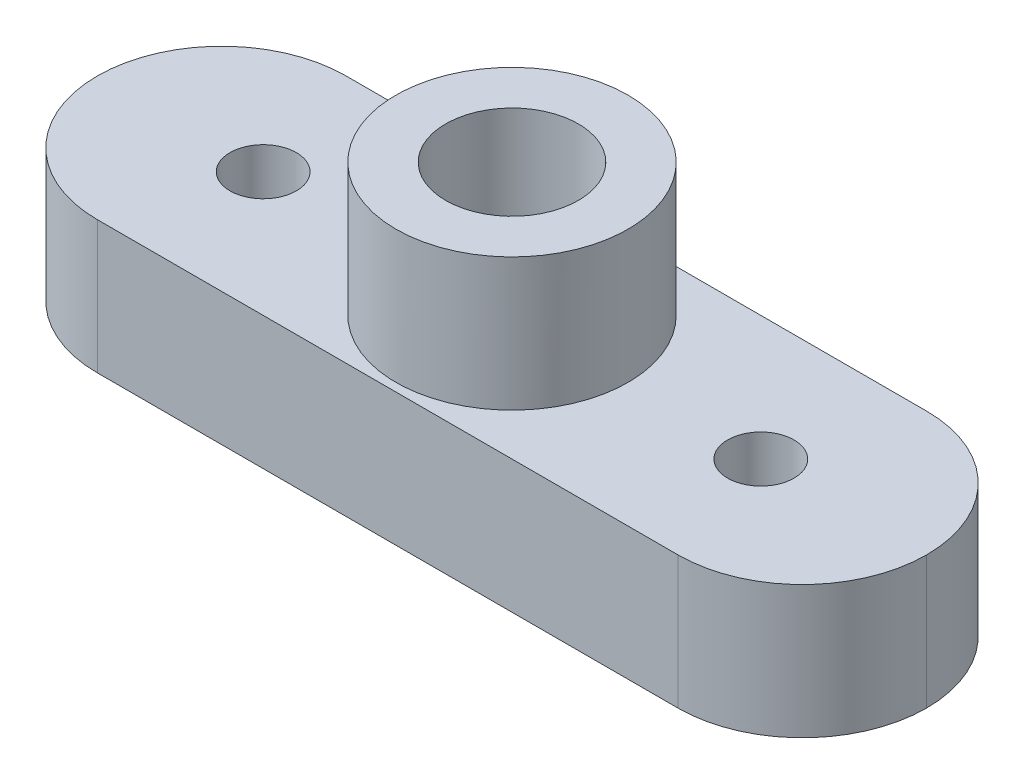
ISO-10303-21;
HEADER;
FILE_DESCRIPTION(('STEP AP214'),'2;1');
FILE_NAME('part.step','',(''),(''),'','','');
FILE_SCHEMA(('AUTOMOTIVE_DESIGN { 1 0 10303 214 1 1 1 1 }'));
ENDSEC;
DATA;
#1=APPLICATION_CONTEXT('core data for automotive mechanical design processes');
#2=APPLICATION_PROTOCOL_DEFINITION('international standard','automotive_design',2000,#1);
#3=PRODUCT_CONTEXT('',#1,'mechanical');
#4=PRODUCT('Part','Part','',(#3));
#5=PRODUCT_RELATED_PRODUCT_CATEGORY('part','',(#4));
#6=PRODUCT_DEFINITION_FORMATION('','',#4);
#7=PRODUCT_DEFINITION_CONTEXT('part definition',#1,'design');
#8=PRODUCT_DEFINITION('design','',#6,#7);
#9=PRODUCT_DEFINITION_SHAPE('','',#8);
#10=(LENGTH_UNIT() NAMED_UNIT(*) SI_UNIT(.MILLI.,.METRE.));
#11=(NAMED_UNIT(*) PLANE_ANGLE_UNIT() SI_UNIT($,.RADIAN.));
#12=(NAMED_UNIT(*) SI_UNIT($,.STERADIAN.) SOLID_ANGLE_UNIT());
#13=UNCERTAINTY_MEASURE_WITH_UNIT(LENGTH_MEASURE(1.E-05),#10,'distance_accuracy_value','');
#14=(GEOMETRIC_REPRESENTATION_CONTEXT(3) GLOBAL_UNCERTAINTY_ASSIGNED_CONTEXT((#13)) GLOBAL_UNIT_ASSIGNED_CONTEXT((#10,
#11,#12)) REPRESENTATION_CONTEXT('',''));
#15=CARTESIAN_POINT('',(0.,0.,0.));
#16=DIRECTION('',(0.,0.,1.));
#17=DIRECTION('',(1.,0.,0.));
#18=AXIS2_PLACEMENT_3D('',#15,#16,#17);
#19=CARTESIAN_POINT('',(0.,8.,7.5));
#20=DIRECTION('',(0.,0.,-1.));
#21=DIRECTION('',(-1.,0.,0.));
#22=AXIS2_PLACEMENT_3D('',#19,#20,#21);
#23=PLANE('',#22);
#24=DIRECTION('',(1.,0.,0.));
#25=VECTOR('',#24,1.);
#26=CARTESIAN_POINT('',(0.,8.,7.5));
#27=LINE('',#26,#25);
#28=CARTESIAN_POINT('',(-17.5,8.,7.5));
#29=VERTEX_POINT('',#28);
#30=CARTESIAN_POINT('',(17.5,8.,7.5));
#31=VERTEX_POINT('',#30);
#32=EDGE_CURVE('E109',#29,#31,#27,.T.);
#33=ORIENTED_EDGE('',*,*,#32,.F.);
#34=DIRECTION('',(0.,-1.,0.));
#35=VECTOR('',#34,1.);
#36=CARTESIAN_POINT('',(-17.5,8.,7.5));
#37=LINE('',#36,#35);
#38=CARTESIAN_POINT('',(-17.5,0.,7.5));
#39=VERTEX_POINT('',#38);
#40=EDGE_CURVE('E95',#29,#39,#37,.T.);
#41=ORIENTED_EDGE('',*,*,#40,.T.);
#42=DIRECTION('',(1.,0.,0.));
#43=VECTOR('',#42,1.);
#44=CARTESIAN_POINT('',(0.,0.,7.5));
#45=LINE('',#44,#43);
#46=CARTESIAN_POINT('',(17.5,0.,7.5));
#47=VERTEX_POINT('',#46);
#48=EDGE_CURVE('E106',#39,#47,#45,.T.);
#49=ORIENTED_EDGE('',*,*,#48,.T.);
#50=DIRECTION('',(0.,-1.,0.));
#51=VECTOR('',#50,1.);
#52=CARTESIAN_POINT('',(17.5,8.,7.5));
#53=LINE('',#52,#51);
#54=EDGE_CURVE('E111',#47,#31,#53,.F.);
#55=ORIENTED_EDGE('',*,*,#54,.T.);
#56=EDGE_LOOP('',(#33,#41,#49,#55));
#57=FACE_BOUND('',#56,.T.);
#58=ADVANCED_FACE('F37',(#57),#23,.F.);
#59=CARTESIAN_POINT('',(-25.,8.,-7.5));
#60=DIRECTION('',(0.,0.,1.));
#61=DIRECTION('',(1.,0.,0.));
#62=AXIS2_PLACEMENT_3D('',#59,#60,#61);
#63=PLANE('',#62);
#64=DIRECTION('',(-1.,0.,0.));
#65=VECTOR('',#64,1.);
#66=CARTESIAN_POINT('',(-25.,0.,-7.5));
#67=LINE('',#66,#65);
#68=CARTESIAN_POINT('',(17.5,0.,-7.5));
#69=VERTEX_POINT('',#68);
#70=CARTESIAN_POINT('',(-17.5,0.,-7.5));
#71=VERTEX_POINT('',#70);
#72=EDGE_CURVE('E115',#69,#71,#67,.T.);
#73=ORIENTED_EDGE('',*,*,#72,.T.);
#74=DIRECTION('',(0.,-1.,0.));
#75=VECTOR('',#74,1.);
#76=CARTESIAN_POINT('',(-17.5,8.,-7.5));
#77=LINE('',#76,#75);
#78=CARTESIAN_POINT('',(-17.5,8.,-7.5));
#79=VERTEX_POINT('',#78);
#80=EDGE_CURVE('E45',#71,#79,#77,.F.);
#81=ORIENTED_EDGE('',*,*,#80,.T.);
#82=DIRECTION('',(-1.,0.,0.));
#83=VECTOR('',#82,1.);
#84=CARTESIAN_POINT('',(0.,8.,-7.5));
#85=LINE('',#84,#83);
#86=CARTESIAN_POINT('',(17.5,8.,-7.5));
#87=VERTEX_POINT('',#86);
#88=EDGE_CURVE('E121',#87,#79,#85,.T.);
#89=ORIENTED_EDGE('',*,*,#88,.F.);
#90=DIRECTION('',(0.,-1.,0.));
#91=VECTOR('',#90,1.);
#92=CARTESIAN_POINT('',(17.5,8.,-7.5));
#93=LINE('',#92,#91);
#94=EDGE_CURVE('E135',#87,#69,#93,.T.);
#95=ORIENTED_EDGE('',*,*,#94,.T.);
#96=EDGE_LOOP('',(#73,#81,#89,#95));
#97=FACE_BOUND('',#96,.T.);
#98=ADVANCED_FACE('F165',(#97),#63,.F.);
#99=CARTESIAN_POINT('',(0.,8.,0.));
#100=DIRECTION('',(0.,-1.,0.));
#101=DIRECTION('',(0.,0.,-1.));
#102=AXIS2_PLACEMENT_3D('',#99,#100,#101);
#103=PLANE('',#102);
#104=CARTESIAN_POINT('',(0.,8.,0.));
#105=DIRECTION('',(0.,-1.,0.));
#106=DIRECTION('',(0.,0.,-1.));
#107=AXIS2_PLACEMENT_3D('',#104,#105,#106);
#108=CIRCLE('',#107,7.);
#109=CARTESIAN_POINT('',(0.,8.,-7.));
#110=VERTEX_POINT('',#109);
#111=EDGE_CURVE('E11',#110,#110,#108,.F.);
#112=ORIENTED_EDGE('',*,*,#111,.F.);
#113=EDGE_LOOP('',(#112));
#114=FACE_BOUND('',#113,.T.);
#115=CARTESIAN_POINT('',(-15.,8.,0.));
#116=DIRECTION('',(0.,1.,0.));
#117=DIRECTION('',(0.,0.,1.));
#118=AXIS2_PLACEMENT_3D('',#115,#116,#117);
#119=CIRCLE('',#118,2.);
#120=CARTESIAN_POINT('',(-15.,8.,2.));
#121=VERTEX_POINT('',#120);
#122=EDGE_CURVE('E139',#121,#121,#119,.T.);
#123=ORIENTED_EDGE('',*,*,#122,.F.);
#124=EDGE_LOOP('',(#123));
#125=FACE_BOUND('',#124,.T.);
#126=CARTESIAN_POINT('',(15.,8.,0.));
#127=DIRECTION('',(0.,1.,0.));
#128=DIRECTION('',(0.,0.,1.));
#129=AXIS2_PLACEMENT_3D('',#126,#127,#128);
#130=CIRCLE('',#129,2.);
#131=CARTESIAN_POINT('',(15.,8.,2.));
#132=VERTEX_POINT('',#131);
#133=EDGE_CURVE('E149',#132,#132,#130,.T.);
#134=ORIENTED_EDGE('',*,*,#133,.F.);
#135=EDGE_LOOP('',(#134));
#136=FACE_BOUND('',#135,.T.);
#137=CARTESIAN_POINT('',(-17.5,8.,0.));
#138=DIRECTION('',(0.,-1.,0.));
#139=DIRECTION('',(0.,0.,-1.));
#140=AXIS2_PLACEMENT_3D('',#137,#138,#139);
#141=CIRCLE('',#140,7.5);
#142=CARTESIAN_POINT('',(-25.,8.,0.));
#143=VERTEX_POINT('',#142);
#144=EDGE_CURVE('E52',#79,#143,#141,.F.);
#145=ORIENTED_EDGE('',*,*,#144,.T.);
#146=CARTESIAN_POINT('',(-17.5,8.,0.));
#147=DIRECTION('',(0.,-1.,0.));
#148=DIRECTION('',(0.,0.,-1.));
#149=AXIS2_PLACEMENT_3D('',#146,#147,#148);
#150=CIRCLE('',#149,7.5);
#151=EDGE_CURVE('E133',#143,#29,#150,.F.);
#152=ORIENTED_EDGE('',*,*,#151,.T.);
#153=ORIENTED_EDGE('',*,*,#32,.T.);
#154=CARTESIAN_POINT('',(17.5,8.,0.));
#155=DIRECTION('',(0.,-1.,0.));
#156=DIRECTION('',(0.,0.,-1.));
#157=AXIS2_PLACEMENT_3D('',#154,#155,#156);
#158=CIRCLE('',#157,7.5);
#159=CARTESIAN_POINT('',(25.,8.,0.));
#160=VERTEX_POINT('',#159);
#161=EDGE_CURVE('E100',#31,#160,#158,.F.);
#162=ORIENTED_EDGE('',*,*,#161,.T.);
#163=CARTESIAN_POINT('',(17.5,8.,0.));
#164=DIRECTION('',(0.,-1.,0.));
#165=DIRECTION('',(0.,0.,-1.));
#166=AXIS2_PLACEMENT_3D('',#163,#164,#165);
#167=CIRCLE('',#166,7.5);
#168=EDGE_CURVE('E130',#160,#87,#167,.F.);
#169=ORIENTED_EDGE('',*,*,#168,.T.);
#170=ORIENTED_EDGE('',*,*,#88,.T.);
#171=EDGE_LOOP('',(#145,#152,#153,#162,#169,#170));
#172=FACE_BOUND('',#171,.T.);
#173=ADVANCED_FACE('F160',(#114,#125,#136,#172),#103,.F.);
#174=CARTESIAN_POINT('',(0.,0.,0.));
#175=DIRECTION('',(0.,-1.,0.));
#176=DIRECTION('',(0.,0.,-1.));
#177=AXIS2_PLACEMENT_3D('',#174,#175,#176);
#178=PLANE('',#177);
#179=CARTESIAN_POINT('',(-15.,0.,0.));
#180=DIRECTION('',(0.,-1.,0.));
#181=DIRECTION('',(0.,0.,-1.));
#182=AXIS2_PLACEMENT_3D('',#179,#180,#181);
#183=CIRCLE('',#182,2.);
#184=CARTESIAN_POINT('',(-15.,0.,-2.));
#185=VERTEX_POINT('',#184);
#186=EDGE_CURVE('E144',#185,#185,#183,.F.);
#187=ORIENTED_EDGE('',*,*,#186,.T.);
#188=EDGE_LOOP('',(#187));
#189=FACE_BOUND('',#188,.T.);
#190=CARTESIAN_POINT('',(15.,0.,0.));
#191=DIRECTION('',(0.,-1.,0.));
#192=DIRECTION('',(0.,0.,-1.));
#193=AXIS2_PLACEMENT_3D('',#190,#191,#192);
#194=CIRCLE('',#193,2.);
#195=CARTESIAN_POINT('',(15.,0.,-2.));
#196=VERTEX_POINT('',#195);
#197=EDGE_CURVE('E157',#196,#196,#194,.F.);
#198=ORIENTED_EDGE('',*,*,#197,.T.);
#199=EDGE_LOOP('',(#198));
#200=FACE_BOUND('',#199,.T.);
#201=ORIENTED_EDGE('',*,*,#48,.F.);
#202=CARTESIAN_POINT('',(-17.5,0.,0.));
#203=DIRECTION('',(0.,-1.,0.));
#204=DIRECTION('',(0.,0.,-1.));
#205=AXIS2_PLACEMENT_3D('',#202,#203,#204);
#206=CIRCLE('',#205,7.5);
#207=CARTESIAN_POINT('',(-25.,0.,0.));
#208=VERTEX_POINT('',#207);
#209=EDGE_CURVE('E91',#39,#208,#206,.T.);
#210=ORIENTED_EDGE('',*,*,#209,.T.);
#211=CARTESIAN_POINT('',(-17.5,0.,0.));
#212=DIRECTION('',(0.,-1.,0.));
#213=DIRECTION('',(0.,0.,-1.));
#214=AXIS2_PLACEMENT_3D('',#211,#212,#213);
#215=CIRCLE('',#214,7.5);
#216=EDGE_CURVE('E101',#208,#71,#215,.T.);
#217=ORIENTED_EDGE('',*,*,#216,.T.);
#218=ORIENTED_EDGE('',*,*,#72,.F.);
#219=CARTESIAN_POINT('',(17.5,0.,0.));
#220=DIRECTION('',(0.,-1.,0.));
#221=DIRECTION('',(0.,0.,-1.));
#222=AXIS2_PLACEMENT_3D('',#219,#220,#221);
#223=CIRCLE('',#222,7.5);
#224=CARTESIAN_POINT('',(25.,0.,0.));
#225=VERTEX_POINT('',#224);
#226=EDGE_CURVE('E126',#69,#225,#223,.T.);
#227=ORIENTED_EDGE('',*,*,#226,.T.);
#228=CARTESIAN_POINT('',(17.5,0.,0.));
#229=DIRECTION('',(0.,-1.,0.));
#230=DIRECTION('',(0.,0.,-1.));
#231=AXIS2_PLACEMENT_3D('',#228,#229,#230);
#232=CIRCLE('',#231,7.5);
#233=EDGE_CURVE('E110',#225,#47,#232,.T.);
#234=ORIENTED_EDGE('',*,*,#233,.T.);
#235=EDGE_LOOP('',(#201,#210,#217,#218,#227,#234));
#236=FACE_BOUND('',#235,.T.);
#237=ADVANCED_FACE('F113',(#189,#200,#236),#178,.T.);
#238=CARTESIAN_POINT('',(-17.5,8.,0.));
#239=DIRECTION('',(0.,-1.,0.));
#240=DIRECTION('',(0.,0.,-1.));
#241=AXIS2_PLACEMENT_3D('',#238,#239,#240);
#242=CYLINDRICAL_SURFACE('',#241,7.5);
#243=DIRECTION('',(0.,-1.,0.));
#244=VECTOR('',#243,1.);
#245=CARTESIAN_POINT('',(-25.,8.,0.));
#246=LINE('',#245,#244);
#247=EDGE_CURVE('E96',#143,#208,#246,.T.);
#248=ORIENTED_EDGE('',*,*,#247,.F.);
#249=ORIENTED_EDGE('',*,*,#144,.F.);
#250=ORIENTED_EDGE('',*,*,#80,.F.);
#251=ORIENTED_EDGE('',*,*,#216,.F.);
#252=EDGE_LOOP('',(#248,#249,#250,#251));
#253=FACE_BOUND('',#252,.T.);
#254=ADVANCED_FACE('F163',(#253),#242,.T.);
#255=CARTESIAN_POINT('',(-17.5,8.,0.));
#256=DIRECTION('',(0.,-1.,0.));
#257=DIRECTION('',(0.,0.,-1.));
#258=AXIS2_PLACEMENT_3D('',#255,#256,#257);
#259=CYLINDRICAL_SURFACE('',#258,7.5);
#260=ORIENTED_EDGE('',*,*,#151,.F.);
#261=ORIENTED_EDGE('',*,*,#247,.T.);
#262=ORIENTED_EDGE('',*,*,#209,.F.);
#263=ORIENTED_EDGE('',*,*,#40,.F.);
#264=EDGE_LOOP('',(#260,#261,#262,#263));
#265=FACE_BOUND('',#264,.T.);
#266=ADVANCED_FACE('F94',(#265),#259,.T.);
#267=CARTESIAN_POINT('',(17.5,8.,0.));
#268=DIRECTION('',(0.,-1.,0.));
#269=DIRECTION('',(0.,0.,-1.));
#270=AXIS2_PLACEMENT_3D('',#267,#268,#269);
#271=CYLINDRICAL_SURFACE('',#270,7.5);
#272=DIRECTION('',(0.,-1.,0.));
#273=VECTOR('',#272,1.);
#274=CARTESIAN_POINT('',(25.,8.,0.));
#275=LINE('',#274,#273);
#276=EDGE_CURVE('E118',#160,#225,#275,.T.);
#277=ORIENTED_EDGE('',*,*,#276,.F.);
#278=ORIENTED_EDGE('',*,*,#161,.F.);
#279=ORIENTED_EDGE('',*,*,#54,.F.);
#280=ORIENTED_EDGE('',*,*,#233,.F.);
#281=EDGE_LOOP('',(#277,#278,#279,#280));
#282=FACE_BOUND('',#281,.T.);
#283=ADVANCED_FACE('F39',(#282),#271,.T.);
#284=CARTESIAN_POINT('',(17.5,8.,0.));
#285=DIRECTION('',(0.,-1.,0.));
#286=DIRECTION('',(0.,0.,-1.));
#287=AXIS2_PLACEMENT_3D('',#284,#285,#286);
#288=CYLINDRICAL_SURFACE('',#287,7.5);
#289=ORIENTED_EDGE('',*,*,#168,.F.);
#290=ORIENTED_EDGE('',*,*,#276,.T.);
#291=ORIENTED_EDGE('',*,*,#226,.F.);
#292=ORIENTED_EDGE('',*,*,#94,.F.);
#293=EDGE_LOOP('',(#289,#290,#291,#292));
#294=FACE_BOUND('',#293,.T.);
#295=ADVANCED_FACE('F166',(#294),#288,.T.);
#296=CARTESIAN_POINT('',(15.,-0.000999999999999265,0.));
#297=DIRECTION('',(0.,1.,0.));
#298=DIRECTION('',(0.,0.,1.));
#299=AXIS2_PLACEMENT_3D('',#296,#297,#298);
#300=CYLINDRICAL_SURFACE('',#299,2.);
#301=ORIENTED_EDGE('',*,*,#197,.F.);
#302=EDGE_LOOP('',(#301));
#303=FACE_BOUND('',#302,.T.);
#304=ORIENTED_EDGE('',*,*,#133,.T.);
#305=EDGE_LOOP('',(#304));
#306=FACE_BOUND('',#305,.T.);
#307=ADVANCED_FACE('F173',(#303,#306),#300,.F.);
#308=CARTESIAN_POINT('',(-15.,-0.000999999999999265,0.));
#309=DIRECTION('',(0.,1.,0.));
#310=DIRECTION('',(0.,0.,1.));
#311=AXIS2_PLACEMENT_3D('',#308,#309,#310);
#312=CYLINDRICAL_SURFACE('',#311,2.);
#313=ORIENTED_EDGE('',*,*,#186,.F.);
#314=EDGE_LOOP('',(#313));
#315=FACE_BOUND('',#314,.T.);
#316=ORIENTED_EDGE('',*,*,#122,.T.);
#317=EDGE_LOOP('',(#316));
#318=FACE_BOUND('',#317,.T.);
#319=ADVANCED_FACE('F198',(#315,#318),#312,.F.);
#320=CARTESIAN_POINT('',(0.,16.,0.));
#321=DIRECTION('',(0.,1.,0.));
#322=DIRECTION('',(0.,0.,1.));
#323=AXIS2_PLACEMENT_3D('',#320,#321,#322);
#324=PLANE('',#323);
#325=CARTESIAN_POINT('',(0.,16.,0.));
#326=DIRECTION('',(0.,1.,0.));
#327=DIRECTION('',(0.,0.,1.));
#328=AXIS2_PLACEMENT_3D('',#325,#326,#327);
#329=CIRCLE('',#328,7.);
#330=CARTESIAN_POINT('',(0.,16.,7.));
#331=VERTEX_POINT('',#330);
#332=EDGE_CURVE('E152',#331,#331,#329,.T.);
#333=ORIENTED_EDGE('',*,*,#332,.T.);
#334=EDGE_LOOP('',(#333));
#335=FACE_BOUND('',#334,.T.);
#336=CARTESIAN_POINT('',(0.,16.,0.));
#337=DIRECTION('',(0.,1.,0.));
#338=DIRECTION('',(0.,0.,1.));
#339=AXIS2_PLACEMENT_3D('',#336,#337,#338);
#340=CIRCLE('',#339,4.);
#341=CARTESIAN_POINT('',(0.,16.,4.));
#342=VERTEX_POINT('',#341);
#343=EDGE_CURVE('E221',#342,#342,#340,.T.);
#344=ORIENTED_EDGE('',*,*,#343,.F.);
#345=EDGE_LOOP('',(#344));
#346=FACE_BOUND('',#345,.T.);
#347=ADVANCED_FACE('F202',(#335,#346),#324,.T.);
#348=CARTESIAN_POINT('',(0.,16.,0.));
#349=DIRECTION('',(0.,-1.,0.));
#350=DIRECTION('',(0.,0.,-1.));
#351=AXIS2_PLACEMENT_3D('',#348,#349,#350);
#352=CYLINDRICAL_SURFACE('',#351,7.);
#353=ORIENTED_EDGE('',*,*,#332,.F.);
#354=EDGE_LOOP('',(#353));
#355=FACE_BOUND('',#354,.T.);
#356=ORIENTED_EDGE('',*,*,#111,.T.);
#357=EDGE_LOOP('',(#356));
#358=FACE_BOUND('',#357,.T.);
#359=ADVANCED_FACE('F204',(#355,#358),#352,.T.);
#360=CARTESIAN_POINT('',(0.,16.,0.));
#361=DIRECTION('',(0.,-1.,0.));
#362=DIRECTION('',(0.,0.,-1.));
#363=AXIS2_PLACEMENT_3D('',#360,#361,#362);
#364=CYLINDRICAL_SURFACE('',#363,4.);
#365=ORIENTED_EDGE('',*,*,#343,.T.);
#366=EDGE_LOOP('',(#365));
#367=FACE_BOUND('',#366,.T.);
#368=CARTESIAN_POINT('',(0.,8.,0.));
#369=DIRECTION('',(0.,1.,0.));
#370=DIRECTION('',(0.,0.,1.));
#371=AXIS2_PLACEMENT_3D('',#368,#369,#370);
#372=CIRCLE('',#371,4.);
#373=CARTESIAN_POINT('',(0.,8.,4.));
#374=VERTEX_POINT('',#373);
#375=EDGE_CURVE('E224',#374,#374,#372,.T.);
#376=ORIENTED_EDGE('',*,*,#375,.F.);
#377=EDGE_LOOP('',(#376));
#378=FACE_BOUND('',#377,.T.);
#379=ADVANCED_FACE('F207',(#367,#378),#364,.F.);
#380=ORIENTED_EDGE('',*,*,#375,.T.);
#381=EDGE_LOOP('',(#380));
#382=FACE_BOUND('',#381,.T.);
#383=ADVANCED_FACE('F193',(#382),#103,.F.);
#384=CLOSED_SHELL('',(#58,#98,#173,#237,#254,#266,#283,#295,#307,#319,#347,#359,#379,#383));
#385=MANIFOLD_SOLID_BREP('B2',#384);
#386=ADVANCED_BREP_SHAPE_REPRESENTATION('',(#18,#385),#14);
#387=SHAPE_DEFINITION_REPRESENTATION(#9,#386);
ENDSEC;
END-ISO-10303-21;
